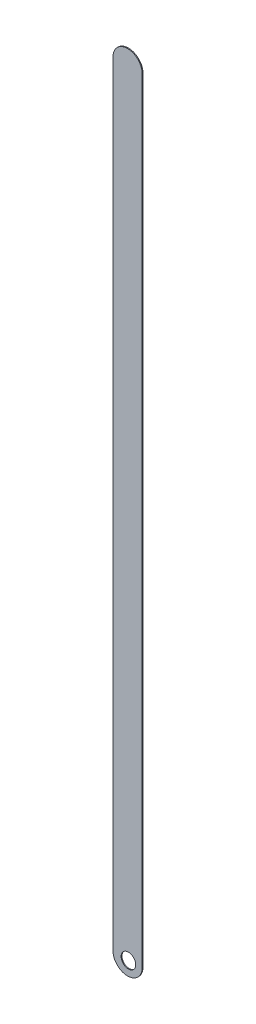
ISO-10303-21;
HEADER;
FILE_DESCRIPTION(('STEP AP214'),'2;1');
FILE_NAME('part.step','',(''),(''),'','','');
FILE_SCHEMA(('AUTOMOTIVE_DESIGN { 1 0 10303 214 1 1 1 1 }'));
ENDSEC;
DATA;
#1=APPLICATION_CONTEXT('core data for automotive mechanical design processes');
#2=APPLICATION_PROTOCOL_DEFINITION('international standard','automotive_design',2000,#1);
#3=PRODUCT_CONTEXT('',#1,'mechanical');
#4=PRODUCT('Part','Part','',(#3));
#5=PRODUCT_RELATED_PRODUCT_CATEGORY('part','',(#4));
#6=PRODUCT_DEFINITION_FORMATION('','',#4);
#7=PRODUCT_DEFINITION_CONTEXT('part definition',#1,'design');
#8=PRODUCT_DEFINITION('design','',#6,#7);
#9=PRODUCT_DEFINITION_SHAPE('','',#8);
#10=(LENGTH_UNIT() NAMED_UNIT(*) SI_UNIT(.MILLI.,.METRE.));
#11=(NAMED_UNIT(*) PLANE_ANGLE_UNIT() SI_UNIT($,.RADIAN.));
#12=(NAMED_UNIT(*) SI_UNIT($,.STERADIAN.) SOLID_ANGLE_UNIT());
#13=UNCERTAINTY_MEASURE_WITH_UNIT(LENGTH_MEASURE(1.E-05),#10,'distance_accuracy_value','');
#14=(GEOMETRIC_REPRESENTATION_CONTEXT(3) GLOBAL_UNCERTAINTY_ASSIGNED_CONTEXT((#13)) GLOBAL_UNIT_ASSIGNED_CONTEXT((#10,
#11,#12)) REPRESENTATION_CONTEXT('',''));
#15=CARTESIAN_POINT('',(0.,0.,0.));
#16=DIRECTION('',(0.,0.,1.));
#17=DIRECTION('',(1.,0.,0.));
#18=AXIS2_PLACEMENT_3D('',#15,#16,#17);
#19=CARTESIAN_POINT('',(55.46500718,78.53502962,0.));
#20=DIRECTION('',(-1.,0.,0.));
#21=DIRECTION('',(0.,1.,0.));
#22=AXIS2_PLACEMENT_3D('',#19,#20,#21);
#23=PLANE('',#22);
#24=DIRECTION('',(0.,1.,0.));
#25=VECTOR('',#24,1.);
#26=CARTESIAN_POINT('',(55.46500718,78.53502962,0.03556));
#27=LINE('',#26,#25);
#28=CARTESIAN_POINT('',(55.46500718,78.53502962,0.03556));
#29=VERTEX_POINT('',#28);
#30=CARTESIAN_POINT('',(55.46500718,110.27400602,0.03556));
#31=VERTEX_POINT('',#30);
#32=EDGE_CURVE('E11',#29,#31,#27,.T.);
#33=ORIENTED_EDGE('',*,*,#32,.F.);
#34=DIRECTION('',(0.,0.,1.));
#35=VECTOR('',#34,1.);
#36=CARTESIAN_POINT('',(55.46500718,78.53502962,0.));
#37=LINE('',#36,#35);
#38=CARTESIAN_POINT('',(55.46500718,78.53502962,0.));
#39=VERTEX_POINT('',#38);
#40=EDGE_CURVE('E24',#39,#29,#37,.T.);
#41=ORIENTED_EDGE('',*,*,#40,.F.);
#42=DIRECTION('',(0.,1.,0.));
#43=VECTOR('',#42,1.);
#44=CARTESIAN_POINT('',(55.46500718,78.53502962,0.));
#45=LINE('',#44,#43);
#46=CARTESIAN_POINT('',(55.46500718,110.27400602,0.));
#47=VERTEX_POINT('',#46);
#48=EDGE_CURVE('E96',#39,#47,#45,.T.);
#49=ORIENTED_EDGE('',*,*,#48,.T.);
#50=DIRECTION('',(0.,0.,1.));
#51=VECTOR('',#50,1.);
#52=CARTESIAN_POINT('',(55.46500718,110.27400602,0.));
#53=LINE('',#52,#51);
#54=EDGE_CURVE('E37',#47,#31,#53,.T.);
#55=ORIENTED_EDGE('',*,*,#54,.T.);
#56=EDGE_LOOP('',(#33,#41,#49,#55));
#57=FACE_BOUND('',#56,.T.);
#58=ADVANCED_FACE('F17',(#57),#23,.F.);
#59=CARTESIAN_POINT('',(54.86500838,78.53502962,0.));
#60=DIRECTION('',(0.,0.,-1.));
#61=DIRECTION('',(-1.,0.,0.));
#62=AXIS2_PLACEMENT_3D('',#59,#60,#61);
#63=CYLINDRICAL_SURFACE('',#62,0.599998799999997);
#64=CARTESIAN_POINT('',(54.86500838,78.53502962,0.03556));
#65=DIRECTION('',(0.,0.,1.));
#66=DIRECTION('',(-1.,0.,0.));
#67=AXIS2_PLACEMENT_3D('',#64,#65,#66);
#68=CIRCLE('',#67,0.599998799999997);
#69=CARTESIAN_POINT('',(54.26500958,78.53502962,0.03556));
#70=VERTEX_POINT('',#69);
#71=EDGE_CURVE('E92',#70,#29,#68,.T.);
#72=ORIENTED_EDGE('',*,*,#71,.F.);
#73=DIRECTION('',(0.,0.,1.));
#74=VECTOR('',#73,1.);
#75=CARTESIAN_POINT('',(54.26500958,78.53502962,0.));
#76=LINE('',#75,#74);
#77=CARTESIAN_POINT('',(54.26500958,78.53502962,0.));
#78=VERTEX_POINT('',#77);
#79=EDGE_CURVE('E90',#78,#70,#76,.T.);
#80=ORIENTED_EDGE('',*,*,#79,.F.);
#81=CARTESIAN_POINT('',(54.86500838,78.53502962,0.));
#82=DIRECTION('',(0.,0.,1.));
#83=DIRECTION('',(-1.,0.,0.));
#84=AXIS2_PLACEMENT_3D('',#81,#82,#83);
#85=CIRCLE('',#84,0.599998799999997);
#86=EDGE_CURVE('E88',#78,#39,#85,.T.);
#87=ORIENTED_EDGE('',*,*,#86,.T.);
#88=ORIENTED_EDGE('',*,*,#40,.T.);
#89=EDGE_LOOP('',(#72,#80,#87,#88));
#90=FACE_BOUND('',#89,.T.);
#91=ADVANCED_FACE('F111',(#90),#63,.T.);
#92=CARTESIAN_POINT('',(54.86500838,110.27400602,0.));
#93=DIRECTION('',(0.,0.,-1.));
#94=DIRECTION('',(1.,0.,0.));
#95=AXIS2_PLACEMENT_3D('',#92,#93,#94);
#96=CYLINDRICAL_SURFACE('',#95,0.599998799999997);
#97=CARTESIAN_POINT('',(54.86500838,110.27400602,0.03556));
#98=DIRECTION('',(0.,0.,1.));
#99=DIRECTION('',(1.,0.,0.));
#100=AXIS2_PLACEMENT_3D('',#97,#98,#99);
#101=CIRCLE('',#100,0.599998799999997);
#102=CARTESIAN_POINT('',(54.26500958,110.27400602,0.03556));
#103=VERTEX_POINT('',#102);
#104=EDGE_CURVE('E85',#31,#103,#101,.T.);
#105=ORIENTED_EDGE('',*,*,#104,.F.);
#106=ORIENTED_EDGE('',*,*,#54,.F.);
#107=CARTESIAN_POINT('',(54.86500838,110.27400602,0.));
#108=DIRECTION('',(0.,0.,1.));
#109=DIRECTION('',(1.,0.,0.));
#110=AXIS2_PLACEMENT_3D('',#107,#108,#109);
#111=CIRCLE('',#110,0.599998799999997);
#112=CARTESIAN_POINT('',(54.26500958,110.27400602,0.));
#113=VERTEX_POINT('',#112);
#114=EDGE_CURVE('E82',#47,#113,#111,.T.);
#115=ORIENTED_EDGE('',*,*,#114,.T.);
#116=DIRECTION('',(0.,0.,1.));
#117=VECTOR('',#116,1.);
#118=CARTESIAN_POINT('',(54.26500958,110.27400602,0.));
#119=LINE('',#118,#117);
#120=EDGE_CURVE('E80',#113,#103,#119,.T.);
#121=ORIENTED_EDGE('',*,*,#120,.T.);
#122=EDGE_LOOP('',(#105,#106,#115,#121));
#123=FACE_BOUND('',#122,.T.);
#124=ADVANCED_FACE('F104',(#123),#96,.T.);
#125=CARTESIAN_POINT('',(54.26500958,110.27400602,0.));
#126=DIRECTION('',(1.,0.,0.));
#127=DIRECTION('',(0.,-1.,0.));
#128=AXIS2_PLACEMENT_3D('',#125,#126,#127);
#129=PLANE('',#128);
#130=DIRECTION('',(0.,-1.,0.));
#131=VECTOR('',#130,1.);
#132=CARTESIAN_POINT('',(54.26500958,110.27400602,0.03556));
#133=LINE('',#132,#131);
#134=EDGE_CURVE('E77',#103,#70,#133,.T.);
#135=ORIENTED_EDGE('',*,*,#134,.F.);
#136=ORIENTED_EDGE('',*,*,#120,.F.);
#137=DIRECTION('',(0.,-1.,0.));
#138=VECTOR('',#137,1.);
#139=CARTESIAN_POINT('',(54.26500958,110.27400602,0.));
#140=LINE('',#139,#138);
#141=EDGE_CURVE('E68',#113,#78,#140,.T.);
#142=ORIENTED_EDGE('',*,*,#141,.T.);
#143=ORIENTED_EDGE('',*,*,#79,.T.);
#144=EDGE_LOOP('',(#135,#136,#142,#143));
#145=FACE_BOUND('',#144,.T.);
#146=ADVANCED_FACE('F110',(#145),#129,.F.);
#147=CARTESIAN_POINT('',(54.9000172,78.5000208,0.));
#148=DIRECTION('',(0.,0.,-1.));
#149=DIRECTION('',(1.,0.,0.));
#150=AXIS2_PLACEMENT_3D('',#147,#148,#149);
#151=CYLINDRICAL_SURFACE('',#150,0.2999994);
#152=DIRECTION('',(0.,0.,1.));
#153=VECTOR('',#152,1.);
#154=CARTESIAN_POINT('',(55.2000166,78.5000208,0.));
#155=LINE('',#154,#153);
#156=CARTESIAN_POINT('',(55.2000166,78.5000208,0.));
#157=VERTEX_POINT('',#156);
#158=CARTESIAN_POINT('',(55.2000166,78.5000208,0.03556));
#159=VERTEX_POINT('',#158);
#160=EDGE_CURVE('E62',#157,#159,#155,.T.);
#161=ORIENTED_EDGE('',*,*,#160,.T.);
#162=CARTESIAN_POINT('',(54.9000172,78.5000208,0.03556));
#163=DIRECTION('',(0.,0.,1.));
#164=DIRECTION('',(1.,0.,0.));
#165=AXIS2_PLACEMENT_3D('',#162,#163,#164);
#166=CIRCLE('',#165,0.2999994);
#167=EDGE_CURVE('E67',#159,#159,#166,.T.);
#168=ORIENTED_EDGE('',*,*,#167,.T.);
#169=ORIENTED_EDGE('',*,*,#160,.F.);
#170=CARTESIAN_POINT('',(54.9000172,78.5000208,0.));
#171=DIRECTION('',(0.,0.,1.));
#172=DIRECTION('',(1.,0.,0.));
#173=AXIS2_PLACEMENT_3D('',#170,#171,#172);
#174=CIRCLE('',#173,0.2999994);
#175=EDGE_CURVE('E65',#157,#157,#174,.T.);
#176=ORIENTED_EDGE('',*,*,#175,.F.);
#177=EDGE_LOOP('',(#161,#168,#169,#176));
#178=FACE_BOUND('',#177,.T.);
#179=ADVANCED_FACE('F64',(#178),#151,.F.);
#180=CARTESIAN_POINT('',(55.46500718,78.53502962,0.));
#181=DIRECTION('',(0.,0.,-1.));
#182=DIRECTION('',(-1.,0.,0.));
#183=AXIS2_PLACEMENT_3D('',#180,#181,#182);
#184=PLANE('',#183);
#185=ORIENTED_EDGE('',*,*,#48,.F.);
#186=ORIENTED_EDGE('',*,*,#86,.F.);
#187=ORIENTED_EDGE('',*,*,#141,.F.);
#188=ORIENTED_EDGE('',*,*,#114,.F.);
#189=EDGE_LOOP('',(#185,#186,#187,#188));
#190=FACE_BOUND('',#189,.T.);
#191=ORIENTED_EDGE('',*,*,#175,.T.);
#192=EDGE_LOOP('',(#191));
#193=FACE_BOUND('',#192,.T.);
#194=ADVANCED_FACE('F71',(#190,#193),#184,.T.);
#195=CARTESIAN_POINT('',(55.46500718,78.53502962,0.03556));
#196=DIRECTION('',(0.,0.,-1.));
#197=DIRECTION('',(-1.,0.,0.));
#198=AXIS2_PLACEMENT_3D('',#195,#196,#197);
#199=PLANE('',#198);
#200=ORIENTED_EDGE('',*,*,#134,.T.);
#201=ORIENTED_EDGE('',*,*,#71,.T.);
#202=ORIENTED_EDGE('',*,*,#32,.T.);
#203=ORIENTED_EDGE('',*,*,#104,.T.);
#204=EDGE_LOOP('',(#200,#201,#202,#203));
#205=FACE_BOUND('',#204,.T.);
#206=ORIENTED_EDGE('',*,*,#167,.F.);
#207=EDGE_LOOP('',(#206));
#208=FACE_BOUND('',#207,.T.);
#209=ADVANCED_FACE('F107',(#205,#208),#199,.F.);
#210=CLOSED_SHELL('',(#58,#91,#124,#146,#179,#194,#209));
#211=MANIFOLD_SOLID_BREP('B1',#210);
#212=ADVANCED_BREP_SHAPE_REPRESENTATION('',(#18,#211),#14);
#213=SHAPE_DEFINITION_REPRESENTATION(#9,#212);
ENDSEC;
END-ISO-10303-21;
